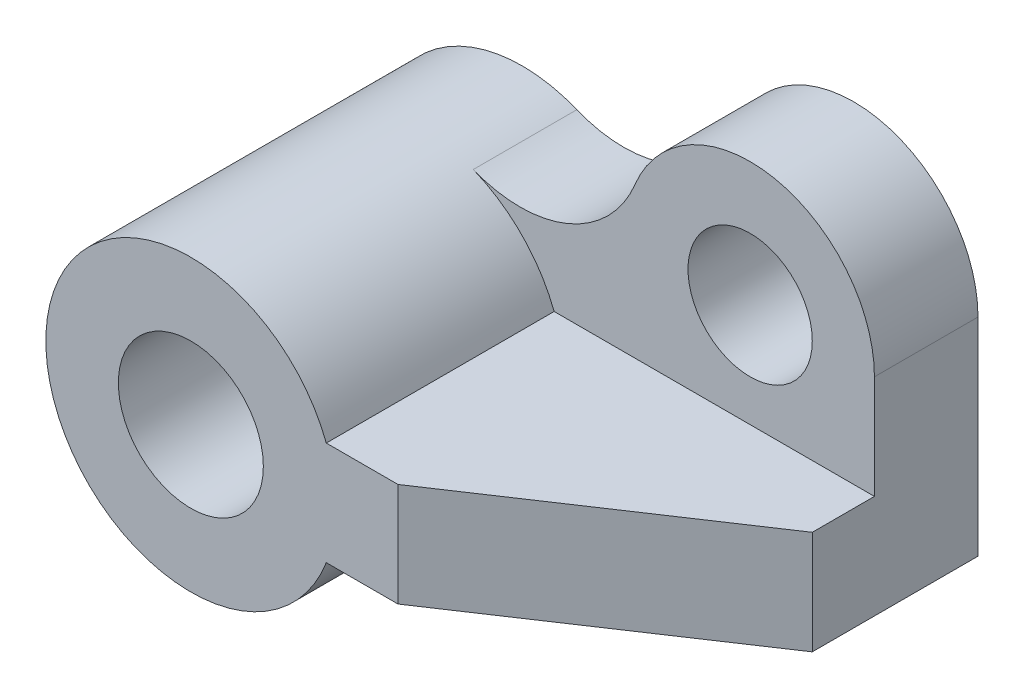
ISO-10303-21;
HEADER;
FILE_DESCRIPTION(('STEP AP214'),'2;1');
FILE_NAME('part.step','',(''),(''),'','','');
FILE_SCHEMA(('AUTOMOTIVE_DESIGN { 1 0 10303 214 1 1 1 1 }'));
ENDSEC;
DATA;
#1=APPLICATION_CONTEXT('core data for automotive mechanical design processes');
#2=APPLICATION_PROTOCOL_DEFINITION('international standard','automotive_design',2000,#1);
#3=PRODUCT_CONTEXT('',#1,'mechanical');
#4=PRODUCT('Part','Part','',(#3));
#5=PRODUCT_RELATED_PRODUCT_CATEGORY('part','',(#4));
#6=PRODUCT_DEFINITION_FORMATION('','',#4);
#7=PRODUCT_DEFINITION_CONTEXT('part definition',#1,'design');
#8=PRODUCT_DEFINITION('design','',#6,#7);
#9=PRODUCT_DEFINITION_SHAPE('','',#8);
#10=(LENGTH_UNIT() NAMED_UNIT(*) SI_UNIT(.MILLI.,.METRE.));
#11=(NAMED_UNIT(*) PLANE_ANGLE_UNIT() SI_UNIT($,.RADIAN.));
#12=(NAMED_UNIT(*) SI_UNIT($,.STERADIAN.) SOLID_ANGLE_UNIT());
#13=UNCERTAINTY_MEASURE_WITH_UNIT(LENGTH_MEASURE(1.E-05),#10,'distance_accuracy_value','');
#14=(GEOMETRIC_REPRESENTATION_CONTEXT(3) GLOBAL_UNCERTAINTY_ASSIGNED_CONTEXT((#13)) GLOBAL_UNIT_ASSIGNED_CONTEXT((#10,
#11,#12)) REPRESENTATION_CONTEXT('',''));
#15=CARTESIAN_POINT('',(0.,0.,0.));
#16=DIRECTION('',(0.,0.,1.));
#17=DIRECTION('',(1.,0.,0.));
#18=AXIS2_PLACEMENT_3D('',#15,#16,#17);
#19=CARTESIAN_POINT('',(0.,5.,32.));
#20=DIRECTION('',(0.,1.,0.));
#21=DIRECTION('',(0.,0.,1.));
#22=AXIS2_PLACEMENT_3D('',#19,#20,#21);
#23=PLANE('',#22);
#24=DIRECTION('',(1.,0.,0.));
#25=VECTOR('',#24,1.);
#26=CARTESIAN_POINT('',(0.,5.,32.));
#27=LINE('',#26,#25);
#28=CARTESIAN_POINT('',(13.076696830622,5.,32.));
#29=VERTEX_POINT('',#28);
#30=CARTESIAN_POINT('',(19.9999999999999,5.,32.));
#31=VERTEX_POINT('',#30);
#32=EDGE_CURVE('E189',#29,#31,#27,.T.);
#33=ORIENTED_EDGE('',*,*,#32,.T.);
#34=DIRECTION('',(0.832050294337844,0.,-0.554700196225228));
#35=VECTOR('',#34,1.);
#36=CARTESIAN_POINT('',(6.15384615384609,5.,41.2307692307692));
#37=LINE('',#36,#35);
#38=CARTESIAN_POINT('',(44.,5.,16.));
#39=VERTEX_POINT('',#38);
#40=EDGE_CURVE('E85',#31,#39,#37,.T.);
#41=ORIENTED_EDGE('',*,*,#40,.T.);
#42=DIRECTION('',(0.,0.,-1.));
#43=VECTOR('',#42,1.);
#44=CARTESIAN_POINT('',(44.,5.,32.));
#45=LINE('',#44,#43);
#46=CARTESIAN_POINT('',(44.,5.,10.));
#47=VERTEX_POINT('',#46);
#48=EDGE_CURVE('E201',#39,#47,#45,.T.);
#49=ORIENTED_EDGE('',*,*,#48,.T.);
#50=DIRECTION('',(1.,0.,0.));
#51=VECTOR('',#50,1.);
#52=CARTESIAN_POINT('',(0.,5.,10.));
#53=LINE('',#52,#51);
#54=CARTESIAN_POINT('',(13.076696830622,5.,10.));
#55=VERTEX_POINT('',#54);
#56=EDGE_CURVE('E156',#55,#47,#53,.T.);
#57=ORIENTED_EDGE('',*,*,#56,.F.);
#58=DIRECTION('',(0.,0.,-1.));
#59=VECTOR('',#58,1.);
#60=CARTESIAN_POINT('',(13.076696830622,5.,32.));
#61=LINE('',#60,#59);
#62=EDGE_CURVE('E154',#29,#55,#61,.T.);
#63=ORIENTED_EDGE('',*,*,#62,.F.);
#64=EDGE_LOOP('',(#33,#41,#49,#57,#63));
#65=FACE_BOUND('',#64,.T.);
#66=ADVANCED_FACE('F61',(#65),#23,.T.);
#67=CARTESIAN_POINT('',(0.,0.,32.));
#68=DIRECTION('',(0.,0.,-1.));
#69=DIRECTION('',(-1.,0.,0.));
#70=AXIS2_PLACEMENT_3D('',#67,#68,#69);
#71=CYLINDRICAL_SURFACE('',#70,14.);
#72=CARTESIAN_POINT('',(0.,0.,10.));
#73=DIRECTION('',(0.,0.,1.));
#74=DIRECTION('',(1.,0.,0.));
#75=AXIS2_PLACEMENT_3D('',#72,#73,#74);
#76=CIRCLE('',#75,14.);
#77=CARTESIAN_POINT('',(5.26995068689771,12.9702590474387,10.));
#78=VERTEX_POINT('',#77);
#79=EDGE_CURVE('E143',#55,#78,#76,.T.);
#80=ORIENTED_EDGE('',*,*,#79,.T.);
#81=DIRECTION('',(0.,0.,-1.));
#82=VECTOR('',#81,1.);
#83=CARTESIAN_POINT('',(5.26995068689771,12.9702590474387,10.));
#84=LINE('',#83,#82);
#85=CARTESIAN_POINT('',(5.26995068689771,12.9702590474387,0.));
#86=VERTEX_POINT('',#85);
#87=EDGE_CURVE('E126',#78,#86,#84,.T.);
#88=ORIENTED_EDGE('',*,*,#87,.T.);
#89=CARTESIAN_POINT('',(0.,0.,0.));
#90=DIRECTION('',(0.,0.,1.));
#91=DIRECTION('',(1.,0.,0.));
#92=AXIS2_PLACEMENT_3D('',#89,#90,#91);
#93=CIRCLE('',#92,14.);
#94=CARTESIAN_POINT('',(13.076696830622,-5.,0.));
#95=VERTEX_POINT('',#94);
#96=EDGE_CURVE('E205',#86,#95,#93,.T.);
#97=ORIENTED_EDGE('',*,*,#96,.T.);
#98=DIRECTION('',(0.,0.,-1.));
#99=VECTOR('',#98,1.);
#100=CARTESIAN_POINT('',(13.076696830622,-5.,32.));
#101=LINE('',#100,#99);
#102=CARTESIAN_POINT('',(13.076696830622,-5.,32.));
#103=VERTEX_POINT('',#102);
#104=EDGE_CURVE('E219',#103,#95,#101,.T.);
#105=ORIENTED_EDGE('',*,*,#104,.F.);
#106=CARTESIAN_POINT('',(0.,0.,32.));
#107=DIRECTION('',(0.,0.,1.));
#108=DIRECTION('',(1.,0.,0.));
#109=AXIS2_PLACEMENT_3D('',#106,#107,#108);
#110=CIRCLE('',#109,14.);
#111=EDGE_CURVE('E193',#29,#103,#110,.T.);
#112=ORIENTED_EDGE('',*,*,#111,.F.);
#113=ORIENTED_EDGE('',*,*,#62,.T.);
#114=EDGE_LOOP('',(#80,#88,#97,#105,#112,#113));
#115=FACE_BOUND('',#114,.T.);
#116=ADVANCED_FACE('F152',(#115),#71,.T.);
#117=CARTESIAN_POINT('',(0.,-5.,32.));
#118=DIRECTION('',(0.,1.,0.));
#119=DIRECTION('',(0.,0.,1.));
#120=AXIS2_PLACEMENT_3D('',#117,#118,#119);
#121=PLANE('',#120);
#122=DIRECTION('',(0.,0.,-1.));
#123=VECTOR('',#122,1.);
#124=CARTESIAN_POINT('',(44.,-5.,32.));
#125=LINE('',#124,#123);
#126=CARTESIAN_POINT('',(44.,-5.,16.));
#127=VERTEX_POINT('',#126);
#128=CARTESIAN_POINT('',(44.,-5.,0.));
#129=VERTEX_POINT('',#128);
#130=EDGE_CURVE('E216',#127,#129,#125,.T.);
#131=ORIENTED_EDGE('',*,*,#130,.F.);
#132=DIRECTION('',(-0.832050294337844,0.,0.554700196225228));
#133=VECTOR('',#132,1.);
#134=CARTESIAN_POINT('',(19.9999999999999,-5.,32.));
#135=LINE('',#134,#133);
#136=CARTESIAN_POINT('',(19.9999999999999,-5.,32.));
#137=VERTEX_POINT('',#136);
#138=EDGE_CURVE('E13',#127,#137,#135,.T.);
#139=ORIENTED_EDGE('',*,*,#138,.T.);
#140=DIRECTION('',(1.,0.,0.));
#141=VECTOR('',#140,1.);
#142=CARTESIAN_POINT('',(0.,-5.,32.));
#143=LINE('',#142,#141);
#144=EDGE_CURVE('E197',#103,#137,#143,.T.);
#145=ORIENTED_EDGE('',*,*,#144,.F.);
#146=ORIENTED_EDGE('',*,*,#104,.T.);
#147=DIRECTION('',(1.,0.,0.));
#148=VECTOR('',#147,1.);
#149=CARTESIAN_POINT('',(0.,-5.,0.));
#150=LINE('',#149,#148);
#151=EDGE_CURVE('E208',#95,#129,#150,.T.);
#152=ORIENTED_EDGE('',*,*,#151,.T.);
#153=EDGE_LOOP('',(#131,#139,#145,#146,#152));
#154=FACE_BOUND('',#153,.T.);
#155=ADVANCED_FACE('F240',(#154),#121,.F.);
#156=CARTESIAN_POINT('',(0.,0.,32.));
#157=DIRECTION('',(0.,0.,-1.));
#158=DIRECTION('',(-1.,0.,0.));
#159=AXIS2_PLACEMENT_3D('',#156,#157,#158);
#160=CYLINDRICAL_SURFACE('',#159,7.);
#161=CARTESIAN_POINT('',(0.,0.,32.));
#162=DIRECTION('',(0.,0.,1.));
#163=DIRECTION('',(1.,0.,0.));
#164=AXIS2_PLACEMENT_3D('',#161,#162,#163);
#165=CIRCLE('',#164,7.);
#166=CARTESIAN_POINT('',(7.,0.,32.));
#167=VERTEX_POINT('',#166);
#168=EDGE_CURVE('E185',#167,#167,#165,.T.);
#169=ORIENTED_EDGE('',*,*,#168,.T.);
#170=EDGE_LOOP('',(#169));
#171=FACE_BOUND('',#170,.T.);
#172=CARTESIAN_POINT('',(0.,0.,0.));
#173=DIRECTION('',(0.,0.,1.));
#174=DIRECTION('',(1.,0.,0.));
#175=AXIS2_PLACEMENT_3D('',#172,#173,#174);
#176=CIRCLE('',#175,7.);
#177=CARTESIAN_POINT('',(7.,0.,0.));
#178=VERTEX_POINT('',#177);
#179=EDGE_CURVE('E136',#178,#178,#176,.T.);
#180=ORIENTED_EDGE('',*,*,#179,.F.);
#181=EDGE_LOOP('',(#180));
#182=FACE_BOUND('',#181,.T.);
#183=ADVANCED_FACE('F256',(#171,#182),#160,.F.);
#184=CARTESIAN_POINT('',(44.,0.,32.));
#185=DIRECTION('',(-1.,0.,0.));
#186=DIRECTION('',(0.,0.,1.));
#187=AXIS2_PLACEMENT_3D('',#184,#185,#186);
#188=PLANE('',#187);
#189=ORIENTED_EDGE('',*,*,#48,.F.);
#190=DIRECTION('',(0.,-1.,0.));
#191=VECTOR('',#190,1.);
#192=CARTESIAN_POINT('',(44.,-5.,16.));
#193=LINE('',#192,#191);
#194=EDGE_CURVE('E71',#39,#127,#193,.T.);
#195=ORIENTED_EDGE('',*,*,#194,.T.);
#196=ORIENTED_EDGE('',*,*,#130,.T.);
#197=DIRECTION('',(0.,1.,0.));
#198=VECTOR('',#197,1.);
#199=CARTESIAN_POINT('',(44.,0.,0.));
#200=LINE('',#199,#198);
#201=CARTESIAN_POINT('',(44.,15.,0.));
#202=VERTEX_POINT('',#201);
#203=EDGE_CURVE('E190',#129,#202,#200,.T.);
#204=ORIENTED_EDGE('',*,*,#203,.T.);
#205=DIRECTION('',(0.,0.,-1.));
#206=VECTOR('',#205,1.);
#207=CARTESIAN_POINT('',(44.,15.,10.));
#208=LINE('',#207,#206);
#209=CARTESIAN_POINT('',(44.,15.,10.));
#210=VERTEX_POINT('',#209);
#211=EDGE_CURVE('E137',#210,#202,#208,.T.);
#212=ORIENTED_EDGE('',*,*,#211,.F.);
#213=DIRECTION('',(0.,1.,0.));
#214=VECTOR('',#213,1.);
#215=CARTESIAN_POINT('',(44.,0.,10.));
#216=LINE('',#215,#214);
#217=EDGE_CURVE('E159',#47,#210,#216,.T.);
#218=ORIENTED_EDGE('',*,*,#217,.F.);
#219=EDGE_LOOP('',(#189,#195,#196,#204,#212,#218));
#220=FACE_BOUND('',#219,.T.);
#221=ADVANCED_FACE('F258',(#220),#188,.F.);
#222=CARTESIAN_POINT('',(0.,0.,32.));
#223=DIRECTION('',(0.,0.,1.));
#224=DIRECTION('',(1.,0.,0.));
#225=AXIS2_PLACEMENT_3D('',#222,#223,#224);
#226=PLANE('',#225);
#227=ORIENTED_EDGE('',*,*,#168,.F.);
#228=EDGE_LOOP('',(#227));
#229=FACE_BOUND('',#228,.T.);
#230=ORIENTED_EDGE('',*,*,#144,.T.);
#231=DIRECTION('',(0.,1.,0.));
#232=VECTOR('',#231,1.);
#233=CARTESIAN_POINT('',(19.9999999999999,5.,32.));
#234=LINE('',#233,#232);
#235=EDGE_CURVE('E225',#137,#31,#234,.T.);
#236=ORIENTED_EDGE('',*,*,#235,.T.);
#237=ORIENTED_EDGE('',*,*,#32,.F.);
#238=ORIENTED_EDGE('',*,*,#111,.T.);
#239=EDGE_LOOP('',(#230,#236,#237,#238));
#240=FACE_BOUND('',#239,.T.);
#241=ADVANCED_FACE('F234',(#229,#240),#226,.T.);
#242=CARTESIAN_POINT('',(0.,0.,0.));
#243=DIRECTION('',(0.,0.,1.));
#244=DIRECTION('',(1.,0.,0.));
#245=AXIS2_PLACEMENT_3D('',#242,#243,#244);
#246=PLANE('',#245);
#247=ORIENTED_EDGE('',*,*,#96,.F.);
#248=CARTESIAN_POINT('',(9.78705127566718,24.0876239452434,0.));
#249=DIRECTION('',(0.,0.,1.));
#250=DIRECTION('',(1.,0.,0.));
#251=AXIS2_PLACEMENT_3D('',#248,#249,#250);
#252=CIRCLE('',#251,12.);
#253=CARTESIAN_POINT('',(20.8935256378336,19.5438119726217,0.));
#254=VERTEX_POINT('',#253);
#255=EDGE_CURVE('E131',#86,#254,#252,.T.);
#256=ORIENTED_EDGE('',*,*,#255,.T.);
#257=CARTESIAN_POINT('',(32.,15.,0.));
#258=DIRECTION('',(0.,0.,1.));
#259=DIRECTION('',(1.,0.,0.));
#260=AXIS2_PLACEMENT_3D('',#257,#258,#259);
#261=CIRCLE('',#260,12.);
#262=EDGE_CURVE('E173',#202,#254,#261,.T.);
#263=ORIENTED_EDGE('',*,*,#262,.F.);
#264=ORIENTED_EDGE('',*,*,#203,.F.);
#265=ORIENTED_EDGE('',*,*,#151,.F.);
#266=EDGE_LOOP('',(#247,#256,#263,#264,#265));
#267=FACE_BOUND('',#266,.T.);
#268=ORIENTED_EDGE('',*,*,#179,.T.);
#269=EDGE_LOOP('',(#268));
#270=FACE_BOUND('',#269,.T.);
#271=CARTESIAN_POINT('',(32.,15.,0.));
#272=DIRECTION('',(0.,0.,1.));
#273=DIRECTION('',(1.,0.,0.));
#274=AXIS2_PLACEMENT_3D('',#271,#272,#273);
#275=CIRCLE('',#274,6.);
#276=CARTESIAN_POINT('',(38.,15.,0.));
#277=VERTEX_POINT('',#276);
#278=EDGE_CURVE('E149',#277,#277,#275,.T.);
#279=ORIENTED_EDGE('',*,*,#278,.T.);
#280=EDGE_LOOP('',(#279));
#281=FACE_BOUND('',#280,.T.);
#282=ADVANCED_FACE('F268',(#267,#270,#281),#246,.F.);
#283=CARTESIAN_POINT('',(9.78705127566718,24.0876239452434,10.));
#284=DIRECTION('',(0.,0.,-1.));
#285=DIRECTION('',(-1.,0.,0.));
#286=AXIS2_PLACEMENT_3D('',#283,#284,#285);
#287=CYLINDRICAL_SURFACE('',#286,12.);
#288=ORIENTED_EDGE('',*,*,#255,.F.);
#289=ORIENTED_EDGE('',*,*,#87,.F.);
#290=CARTESIAN_POINT('',(9.78705127566718,24.0876239452434,10.));
#291=DIRECTION('',(0.,0.,1.));
#292=DIRECTION('',(1.,0.,0.));
#293=AXIS2_PLACEMENT_3D('',#290,#291,#292);
#294=CIRCLE('',#293,12.);
#295=CARTESIAN_POINT('',(20.8935256378336,19.5438119726217,10.));
#296=VERTEX_POINT('',#295);
#297=EDGE_CURVE('E129',#78,#296,#294,.T.);
#298=ORIENTED_EDGE('',*,*,#297,.T.);
#299=DIRECTION('',(0.,0.,-1.));
#300=VECTOR('',#299,1.);
#301=CARTESIAN_POINT('',(20.8935256378336,19.5438119726217,10.));
#302=LINE('',#301,#300);
#303=EDGE_CURVE('E170',#296,#254,#302,.T.);
#304=ORIENTED_EDGE('',*,*,#303,.T.);
#305=EDGE_LOOP('',(#288,#289,#298,#304));
#306=FACE_BOUND('',#305,.T.);
#307=ADVANCED_FACE('F128',(#306),#287,.F.);
#308=CARTESIAN_POINT('',(32.,15.,10.));
#309=DIRECTION('',(0.,0.,-1.));
#310=DIRECTION('',(-1.,0.,0.));
#311=AXIS2_PLACEMENT_3D('',#308,#309,#310);
#312=CYLINDRICAL_SURFACE('',#311,12.);
#313=ORIENTED_EDGE('',*,*,#262,.T.);
#314=ORIENTED_EDGE('',*,*,#303,.F.);
#315=CARTESIAN_POINT('',(32.,15.,10.));
#316=DIRECTION('',(0.,0.,1.));
#317=DIRECTION('',(1.,0.,0.));
#318=AXIS2_PLACEMENT_3D('',#315,#316,#317);
#319=CIRCLE('',#318,12.);
#320=EDGE_CURVE('E146',#210,#296,#319,.T.);
#321=ORIENTED_EDGE('',*,*,#320,.F.);
#322=ORIENTED_EDGE('',*,*,#211,.T.);
#323=EDGE_LOOP('',(#313,#314,#321,#322));
#324=FACE_BOUND('',#323,.T.);
#325=ADVANCED_FACE('F276',(#324),#312,.T.);
#326=CARTESIAN_POINT('',(32.,15.,10.));
#327=DIRECTION('',(0.,0.,-1.));
#328=DIRECTION('',(-1.,0.,0.));
#329=AXIS2_PLACEMENT_3D('',#326,#327,#328);
#330=CYLINDRICAL_SURFACE('',#329,6.);
#331=CARTESIAN_POINT('',(32.,15.,10.));
#332=DIRECTION('',(0.,0.,1.));
#333=DIRECTION('',(1.,0.,0.));
#334=AXIS2_PLACEMENT_3D('',#331,#332,#333);
#335=CIRCLE('',#334,6.);
#336=CARTESIAN_POINT('',(38.,15.,10.));
#337=VERTEX_POINT('',#336);
#338=EDGE_CURVE('E166',#337,#337,#335,.T.);
#339=ORIENTED_EDGE('',*,*,#338,.T.);
#340=EDGE_LOOP('',(#339));
#341=FACE_BOUND('',#340,.T.);
#342=ORIENTED_EDGE('',*,*,#278,.F.);
#343=EDGE_LOOP('',(#342));
#344=FACE_BOUND('',#343,.T.);
#345=ADVANCED_FACE('F246',(#341,#344),#330,.F.);
#346=CARTESIAN_POINT('',(0.,0.,10.));
#347=DIRECTION('',(0.,0.,1.));
#348=DIRECTION('',(1.,0.,0.));
#349=AXIS2_PLACEMENT_3D('',#346,#347,#348);
#350=PLANE('',#349);
#351=ORIENTED_EDGE('',*,*,#297,.F.);
#352=ORIENTED_EDGE('',*,*,#79,.F.);
#353=ORIENTED_EDGE('',*,*,#56,.T.);
#354=ORIENTED_EDGE('',*,*,#217,.T.);
#355=ORIENTED_EDGE('',*,*,#320,.T.);
#356=EDGE_LOOP('',(#351,#352,#353,#354,#355));
#357=FACE_BOUND('',#356,.T.);
#358=ORIENTED_EDGE('',*,*,#338,.F.);
#359=EDGE_LOOP('',(#358));
#360=FACE_BOUND('',#359,.T.);
#361=ADVANCED_FACE('F140',(#357,#360),#350,.T.);
#362=CARTESIAN_POINT('',(19.9999999999999,0.,32.));
#363=DIRECTION('',(0.554700196225228,0.,0.832050294337844));
#364=DIRECTION('',(0.,-1.,0.));
#365=AXIS2_PLACEMENT_3D('',#362,#363,#364);
#366=PLANE('',#365);
#367=ORIENTED_EDGE('',*,*,#138,.F.);
#368=ORIENTED_EDGE('',*,*,#194,.F.);
#369=ORIENTED_EDGE('',*,*,#40,.F.);
#370=ORIENTED_EDGE('',*,*,#235,.F.);
#371=EDGE_LOOP('',(#367,#368,#369,#370));
#372=FACE_BOUND('',#371,.T.);
#373=ADVANCED_FACE('F64',(#372),#366,.T.);
#374=CLOSED_SHELL('',(#66,#116,#155,#183,#221,#241,#282,#307,#325,#345,#361,#373));
#375=MANIFOLD_SOLID_BREP('B2',#374);
#376=ADVANCED_BREP_SHAPE_REPRESENTATION('',(#18,#375),#14);
#377=SHAPE_DEFINITION_REPRESENTATION(#9,#376);
ENDSEC;
END-ISO-10303-21;
